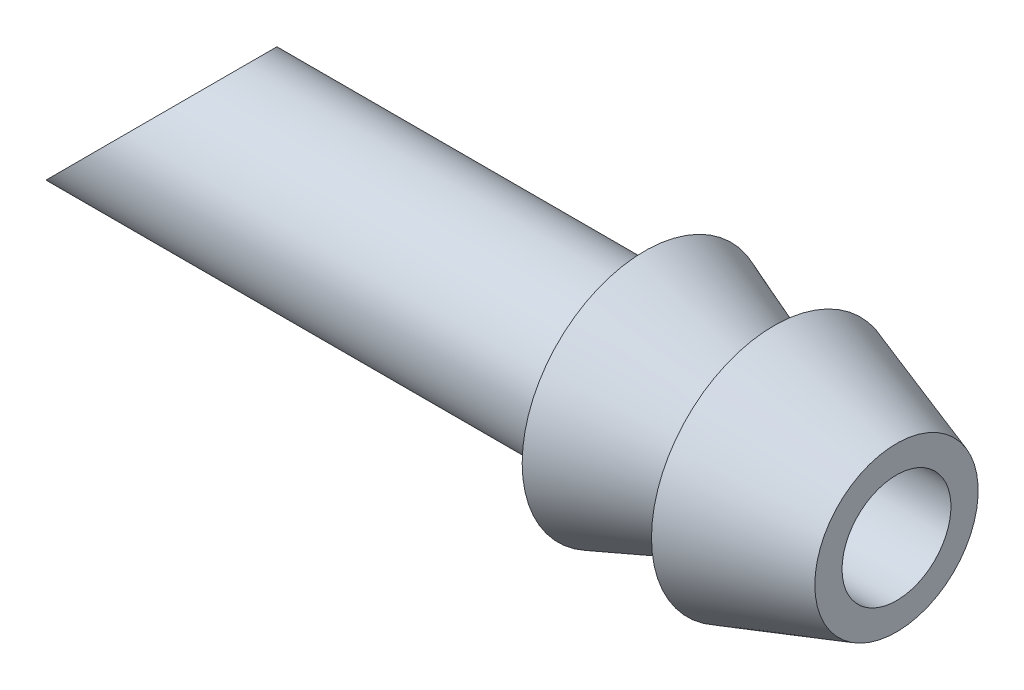
ISO-10303-21;
HEADER;
FILE_DESCRIPTION(('STEP AP214'),'2;1');
FILE_NAME('part.step','',(''),(''),'','','');
FILE_SCHEMA(('AUTOMOTIVE_DESIGN { 1 0 10303 214 1 1 1 1 }'));
ENDSEC;
DATA;
#1=APPLICATION_CONTEXT('core data for automotive mechanical design processes');
#2=APPLICATION_PROTOCOL_DEFINITION('international standard','automotive_design',2000,#1);
#3=PRODUCT_CONTEXT('',#1,'mechanical');
#4=PRODUCT('Part','Part','',(#3));
#5=PRODUCT_RELATED_PRODUCT_CATEGORY('part','',(#4));
#6=PRODUCT_DEFINITION_FORMATION('','',#4);
#7=PRODUCT_DEFINITION_CONTEXT('part definition',#1,'design');
#8=PRODUCT_DEFINITION('design','',#6,#7);
#9=PRODUCT_DEFINITION_SHAPE('','',#8);
#10=(LENGTH_UNIT() NAMED_UNIT(*) SI_UNIT(.MILLI.,.METRE.));
#11=(NAMED_UNIT(*) PLANE_ANGLE_UNIT() SI_UNIT($,.RADIAN.));
#12=(NAMED_UNIT(*) SI_UNIT($,.STERADIAN.) SOLID_ANGLE_UNIT());
#13=UNCERTAINTY_MEASURE_WITH_UNIT(LENGTH_MEASURE(1.E-05),#10,'distance_accuracy_value','');
#14=(GEOMETRIC_REPRESENTATION_CONTEXT(3) GLOBAL_UNCERTAINTY_ASSIGNED_CONTEXT((#13)) GLOBAL_UNIT_ASSIGNED_CONTEXT((#10,
#11,#12)) REPRESENTATION_CONTEXT('',''));
#15=CARTESIAN_POINT('',(0.,0.,0.));
#16=DIRECTION('',(0.,0.,1.));
#17=DIRECTION('',(1.,0.,0.));
#18=AXIS2_PLACEMENT_3D('',#15,#16,#17);
#19=CARTESIAN_POINT('',(0.,0.,0.));
#20=DIRECTION('',(-1.,0.,0.));
#21=DIRECTION('',(0.,0.,1.));
#22=AXIS2_PLACEMENT_3D('',#19,#20,#21);
#23=CYLINDRICAL_SURFACE('',#22,3.);
#24=CARTESIAN_POINT('',(12.9015188718499,0.,0.));
#25=DIRECTION('',(-1.,0.,0.));
#26=DIRECTION('',(0.,0.,1.));
#27=AXIS2_PLACEMENT_3D('',#24,#25,#26);
#28=CIRCLE('',#27,3.);
#29=CARTESIAN_POINT('',(12.9015188718499,0.,3.));
#30=VERTEX_POINT('',#29);
#31=EDGE_CURVE('E10',#30,#30,#28,.T.);
#32=ORIENTED_EDGE('',*,*,#31,.T.);
#33=EDGE_LOOP('',(#32));
#34=FACE_BOUND('',#33,.T.);
#35=CARTESIAN_POINT('',(-4.8484811281501,0.,0.));
#36=DIRECTION('',(-0.707106781186552,0.707106781186543,0.));
#37=DIRECTION('',(-0.707106781186543,-0.707106781186552,0.));
#38=AXIS2_PLACEMENT_3D('',#35,#36,#37);
#39=ELLIPSE('',#38,4.24264068711926,3.);
#40=CARTESIAN_POINT('',(-7.84848112815007,-3.,0.));
#41=VERTEX_POINT('',#40);
#42=EDGE_CURVE('E59',#41,#41,#39,.T.);
#43=ORIENTED_EDGE('',*,*,#42,.F.);
#44=EDGE_LOOP('',(#43));
#45=FACE_BOUND('',#44,.T.);
#46=ADVANCED_FACE('F31',(#34,#45),#23,.T.);
#47=CARTESIAN_POINT('',(0.,0.,0.));
#48=DIRECTION('',(-1.,0.,0.));
#49=DIRECTION('',(0.,0.,1.));
#50=AXIS2_PLACEMENT_3D('',#47,#48,#49);
#51=CYLINDRICAL_SURFACE('',#50,2.);
#52=CARTESIAN_POINT('',(22.1515188718499,0.,0.));
#53=DIRECTION('',(-1.,0.,0.));
#54=DIRECTION('',(0.,0.,1.));
#55=AXIS2_PLACEMENT_3D('',#52,#53,#54);
#56=CIRCLE('',#55,2.);
#57=CARTESIAN_POINT('',(22.1515188718499,0.,2.));
#58=VERTEX_POINT('',#57);
#59=EDGE_CURVE('E56',#58,#58,#56,.T.);
#60=ORIENTED_EDGE('',*,*,#59,.F.);
#61=EDGE_LOOP('',(#60));
#62=FACE_BOUND('',#61,.T.);
#63=CARTESIAN_POINT('',(-4.8484811281501,0.,0.));
#64=DIRECTION('',(-0.707106781186552,0.707106781186543,0.));
#65=DIRECTION('',(-0.707106781186543,-0.707106781186552,0.));
#66=AXIS2_PLACEMENT_3D('',#63,#64,#65);
#67=ELLIPSE('',#66,2.82842712474617,2.);
#68=CARTESIAN_POINT('',(-6.84848112815008,-2.,0.));
#69=VERTEX_POINT('',#68);
#70=EDGE_CURVE('E34',#69,#69,#67,.F.);
#71=ORIENTED_EDGE('',*,*,#70,.F.);
#72=EDGE_LOOP('',(#71));
#73=FACE_BOUND('',#72,.T.);
#74=ADVANCED_FACE('F68',(#62,#73),#51,.F.);
#75=CARTESIAN_POINT('',(12.9015188718499,4.5,0.));
#76=DIRECTION('',(1.,0.,0.));
#77=DIRECTION('',(0.,0.,-1.));
#78=AXIS2_PLACEMENT_3D('',#75,#76,#77);
#79=PLANE('',#78);
#80=ORIENTED_EDGE('',*,*,#31,.F.);
#81=EDGE_LOOP('',(#80));
#82=FACE_BOUND('',#81,.T.);
#83=CARTESIAN_POINT('',(12.9015188718499,0.,0.));
#84=DIRECTION('',(-1.,0.,0.));
#85=DIRECTION('',(0.,0.,1.));
#86=AXIS2_PLACEMENT_3D('',#83,#84,#85);
#87=CIRCLE('',#86,4.5);
#88=CARTESIAN_POINT('',(12.9015188718499,0.,4.5));
#89=VERTEX_POINT('',#88);
#90=EDGE_CURVE('E38',#89,#89,#87,.T.);
#91=ORIENTED_EDGE('',*,*,#90,.T.);
#92=EDGE_LOOP('',(#91));
#93=FACE_BOUND('',#92,.T.);
#94=ADVANCED_FACE('F70',(#82,#93),#79,.F.);
#95=CARTESIAN_POINT('',(16.9015188718499,0.,0.));
#96=DIRECTION('',(-1.,0.,0.));
#97=DIRECTION('',(0.,0.,1.));
#98=AXIS2_PLACEMENT_3D('',#95,#96,#97);
#99=CONICAL_SURFACE('',#98,3.,0.358770670270572);
#100=ORIENTED_EDGE('',*,*,#90,.F.);
#101=EDGE_LOOP('',(#100));
#102=FACE_BOUND('',#101,.T.);
#103=CARTESIAN_POINT('',(16.9015188718499,0.,0.));
#104=DIRECTION('',(-1.,0.,0.));
#105=DIRECTION('',(0.,0.,1.));
#106=AXIS2_PLACEMENT_3D('',#103,#104,#105);
#107=CIRCLE('',#106,3.);
#108=CARTESIAN_POINT('',(16.9015188718499,0.,3.));
#109=VERTEX_POINT('',#108);
#110=EDGE_CURVE('E42',#109,#109,#107,.T.);
#111=ORIENTED_EDGE('',*,*,#110,.T.);
#112=EDGE_LOOP('',(#111));
#113=FACE_BOUND('',#112,.T.);
#114=ADVANCED_FACE('F77',(#102,#113),#99,.T.);
#115=CARTESIAN_POINT('',(0.,0.,0.));
#116=DIRECTION('',(-1.,0.,0.));
#117=DIRECTION('',(0.,0.,1.));
#118=AXIS2_PLACEMENT_3D('',#115,#116,#117);
#119=CYLINDRICAL_SURFACE('',#118,3.);
#120=ORIENTED_EDGE('',*,*,#110,.F.);
#121=EDGE_LOOP('',(#120));
#122=FACE_BOUND('',#121,.T.);
#123=CARTESIAN_POINT('',(17.6515188718499,0.,0.));
#124=DIRECTION('',(-1.,0.,0.));
#125=DIRECTION('',(0.,0.,1.));
#126=AXIS2_PLACEMENT_3D('',#123,#124,#125);
#127=CIRCLE('',#126,3.);
#128=CARTESIAN_POINT('',(17.6515188718499,0.,3.));
#129=VERTEX_POINT('',#128);
#130=EDGE_CURVE('E47',#129,#129,#127,.T.);
#131=ORIENTED_EDGE('',*,*,#130,.T.);
#132=EDGE_LOOP('',(#131));
#133=FACE_BOUND('',#132,.T.);
#134=ADVANCED_FACE('F93',(#122,#133),#119,.T.);
#135=CARTESIAN_POINT('',(17.6515188718499,4.5,0.));
#136=DIRECTION('',(1.,0.,0.));
#137=DIRECTION('',(0.,0.,-1.));
#138=AXIS2_PLACEMENT_3D('',#135,#136,#137);
#139=PLANE('',#138);
#140=ORIENTED_EDGE('',*,*,#130,.F.);
#141=EDGE_LOOP('',(#140));
#142=FACE_BOUND('',#141,.T.);
#143=CARTESIAN_POINT('',(17.6515188718499,0.,0.));
#144=DIRECTION('',(-1.,0.,0.));
#145=DIRECTION('',(0.,0.,1.));
#146=AXIS2_PLACEMENT_3D('',#143,#144,#145);
#147=CIRCLE('',#146,4.5);
#148=CARTESIAN_POINT('',(17.6515188718499,0.,4.5));
#149=VERTEX_POINT('',#148);
#150=EDGE_CURVE('E50',#149,#149,#147,.T.);
#151=ORIENTED_EDGE('',*,*,#150,.T.);
#152=EDGE_LOOP('',(#151));
#153=FACE_BOUND('',#152,.T.);
#154=ADVANCED_FACE('F89',(#142,#153),#139,.F.);
#155=CARTESIAN_POINT('',(22.1515188718499,0.,0.));
#156=DIRECTION('',(-1.,0.,0.));
#157=DIRECTION('',(0.,0.,1.));
#158=AXIS2_PLACEMENT_3D('',#155,#156,#157);
#159=CONICAL_SURFACE('',#158,3.,0.321750554396642);
#160=ORIENTED_EDGE('',*,*,#150,.F.);
#161=EDGE_LOOP('',(#160));
#162=FACE_BOUND('',#161,.T.);
#163=CARTESIAN_POINT('',(22.1515188718499,0.,0.));
#164=DIRECTION('',(-1.,0.,0.));
#165=DIRECTION('',(0.,0.,1.));
#166=AXIS2_PLACEMENT_3D('',#163,#164,#165);
#167=CIRCLE('',#166,3.);
#168=CARTESIAN_POINT('',(22.1515188718499,0.,3.));
#169=VERTEX_POINT('',#168);
#170=EDGE_CURVE('E53',#169,#169,#167,.T.);
#171=ORIENTED_EDGE('',*,*,#170,.T.);
#172=EDGE_LOOP('',(#171));
#173=FACE_BOUND('',#172,.T.);
#174=ADVANCED_FACE('F85',(#162,#173),#159,.T.);
#175=CARTESIAN_POINT('',(22.1515188718499,2.,0.));
#176=DIRECTION('',(-1.,0.,0.));
#177=DIRECTION('',(0.,0.,1.));
#178=AXIS2_PLACEMENT_3D('',#175,#176,#177);
#179=PLANE('',#178);
#180=ORIENTED_EDGE('',*,*,#170,.F.);
#181=EDGE_LOOP('',(#180));
#182=FACE_BOUND('',#181,.T.);
#183=ORIENTED_EDGE('',*,*,#59,.T.);
#184=EDGE_LOOP('',(#183));
#185=FACE_BOUND('',#184,.T.);
#186=ADVANCED_FACE('F82',(#182,#185),#179,.F.);
#187=CARTESIAN_POINT('',(-7.84848112815007,-3.,10.));
#188=DIRECTION('',(-0.707106781186552,0.707106781186543,0.));
#189=DIRECTION('',(-0.707106781186543,-0.707106781186552,0.));
#190=AXIS2_PLACEMENT_3D('',#187,#188,#189);
#191=PLANE('',#190);
#192=ORIENTED_EDGE('',*,*,#70,.T.);
#193=EDGE_LOOP('',(#192));
#194=FACE_BOUND('',#193,.T.);
#195=ORIENTED_EDGE('',*,*,#42,.T.);
#196=EDGE_LOOP('',(#195));
#197=FACE_BOUND('',#196,.T.);
#198=ADVANCED_FACE('F66',(#194,#197),#191,.T.);
#199=CLOSED_SHELL('',(#46,#74,#94,#114,#134,#154,#174,#186,#198));
#200=MANIFOLD_SOLID_BREP('B2',#199);
#201=ADVANCED_BREP_SHAPE_REPRESENTATION('',(#18,#200),#14);
#202=SHAPE_DEFINITION_REPRESENTATION(#9,#201);
ENDSEC;
END-ISO-10303-21;
